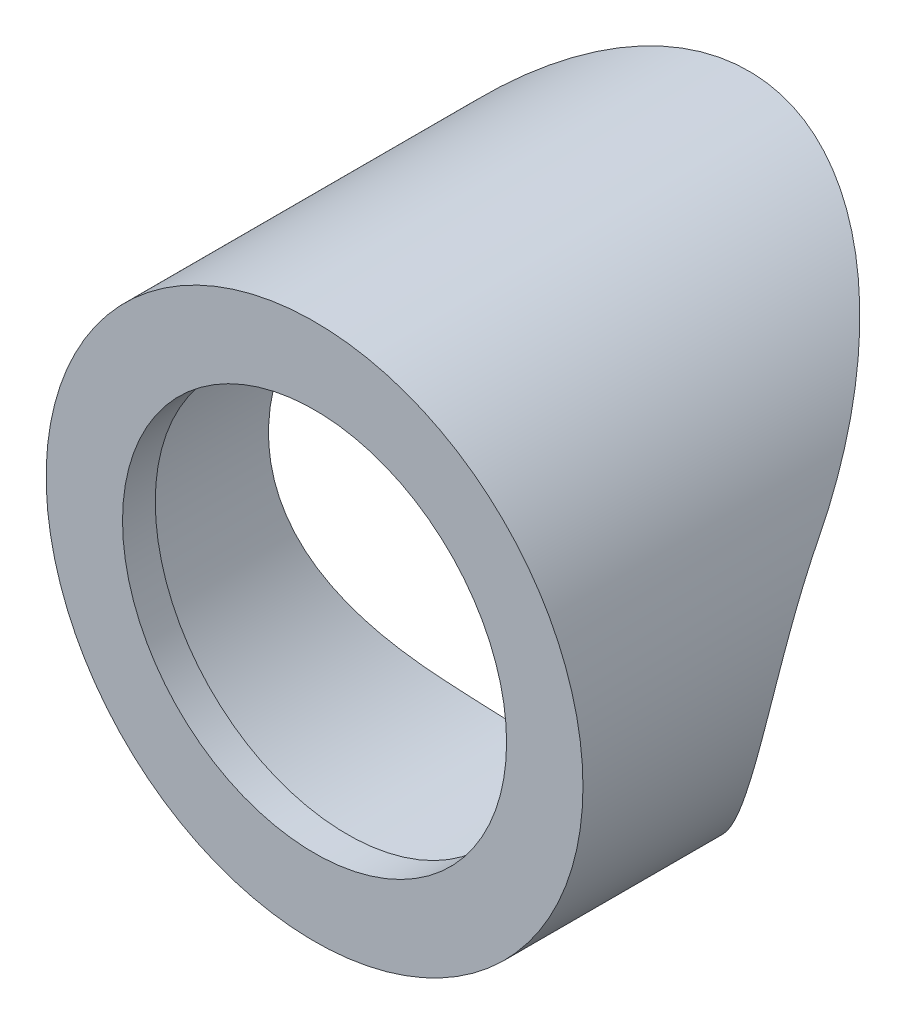
ISO-10303-21;
HEADER;
FILE_DESCRIPTION(('STEP AP214'),'2;1');
FILE_NAME('part.step','',(''),(''),'','','');
FILE_SCHEMA(('AUTOMOTIVE_DESIGN { 1 0 10303 214 1 1 1 1 }'));
ENDSEC;
DATA;
#1=APPLICATION_CONTEXT('core data for automotive mechanical design processes');
#2=APPLICATION_PROTOCOL_DEFINITION('international standard','automotive_design',2000,#1);
#3=PRODUCT_CONTEXT('',#1,'mechanical');
#4=PRODUCT('Part','Part','',(#3));
#5=PRODUCT_RELATED_PRODUCT_CATEGORY('part','',(#4));
#6=PRODUCT_DEFINITION_FORMATION('','',#4);
#7=PRODUCT_DEFINITION_CONTEXT('part definition',#1,'design');
#8=PRODUCT_DEFINITION('design','',#6,#7);
#9=PRODUCT_DEFINITION_SHAPE('','',#8);
#10=(LENGTH_UNIT() NAMED_UNIT(*) SI_UNIT(.MILLI.,.METRE.));
#11=(NAMED_UNIT(*) PLANE_ANGLE_UNIT() SI_UNIT($,.RADIAN.));
#12=(NAMED_UNIT(*) SI_UNIT($,.STERADIAN.) SOLID_ANGLE_UNIT());
#13=UNCERTAINTY_MEASURE_WITH_UNIT(LENGTH_MEASURE(1.E-05),#10,'distance_accuracy_value','');
#14=(GEOMETRIC_REPRESENTATION_CONTEXT(3) GLOBAL_UNCERTAINTY_ASSIGNED_CONTEXT((#13)) GLOBAL_UNIT_ASSIGNED_CONTEXT((#10,
#11,#12)) REPRESENTATION_CONTEXT('',''));
#15=CARTESIAN_POINT('',(0.,0.,0.));
#16=DIRECTION('',(0.,0.,1.));
#17=DIRECTION('',(1.,0.,0.));
#18=AXIS2_PLACEMENT_3D('',#15,#16,#17);
#19=CARTESIAN_POINT('',(0.,0.,0.));
#20=DIRECTION('',(0.,0.,1.));
#21=DIRECTION('',(1.,0.,0.));
#22=AXIS2_PLACEMENT_3D('',#19,#20,#21);
#23=CYLINDRICAL_SURFACE('',#22,10.8);
#24=CARTESIAN_POINT('',(10.1174201894594,3.77859877599078,-11.3604184643851));
#25=CARTESIAN_POINT('',(10.1794931564768,3.61242547592925,-11.1938837947332));
#26=CARTESIAN_POINT('',(10.2392537936822,3.43989023089011,-11.0327415753184));
#27=CARTESIAN_POINT('',(10.3524528996894,3.08250314850726,-10.7220157417117));
#28=CARTESIAN_POINT('',(10.4058860181338,2.89764109151905,-10.5724419459727));
#29=CARTESIAN_POINT('',(10.5049574524424,2.51499479401015,-10.2849372562771));
#30=CARTESIAN_POINT('',(10.5505404180285,2.31713138354535,-10.1470922495286));
#31=CARTESIAN_POINT('',(10.6316925962494,1.91051625282432,-9.88527239071304));
#32=CARTESIAN_POINT('',(10.6672642748281,1.70176722891484,-9.76129412758158));
#33=CARTESIAN_POINT('',(10.726878703958,1.27323657642441,-9.52757700378918));
#34=CARTESIAN_POINT('',(10.7508536791937,1.05339818966113,-9.41792452279212));
#35=CARTESIAN_POINT('',(10.7853640473005,0.605313972263464,-9.21476558539735));
#36=CARTESIAN_POINT('',(10.7958985422696,0.377067580973459,-9.12126020808069));
#37=CARTESIAN_POINT('',(10.8021282547242,-0.0851100916871967,-8.95162642835171));
#38=CARTESIAN_POINT('',(10.7978751092792,-0.319018764407659,-8.87543854604315));
#39=CARTESIAN_POINT('',(10.773581696638,-0.791049377165576,-8.74069457667046));
#40=CARTESIAN_POINT('',(10.7535436022563,-1.02917073291327,-8.68213606443869));
#41=CARTESIAN_POINT('',(10.6999389081166,-1.48254136705154,-8.58805361255833));
#42=CARTESIAN_POINT('',(10.6679784233919,-1.69762009931701,-8.55077830026144));
#43=CARTESIAN_POINT('',(10.5906549645977,-2.12736440740652,-8.49056964525188));
#44=CARTESIAN_POINT('',(10.5452929244348,-2.3420300109712,-8.46763530351511));
#45=CARTESIAN_POINT('',(10.4412277241132,-2.76932510382129,-8.435737797571));
#46=CARTESIAN_POINT('',(10.3825139070613,-2.98195282449246,-8.42678583873876));
#47=CARTESIAN_POINT('',(10.2521209867481,-3.40333047378461,-8.42226134160314));
#48=CARTESIAN_POINT('',(10.1804416772089,-3.61208034065154,-8.42668901618437));
#49=CARTESIAN_POINT('',(10.0277272725771,-4.01615543164467,-8.44765314971861));
#50=CARTESIAN_POINT('',(9.94716771253965,-4.21168639330762,-8.46370926975622));
#51=CARTESIAN_POINT('',(9.77517875587511,-4.59677827367746,-8.50649217455549));
#52=CARTESIAN_POINT('',(9.68374526837359,-4.7863369113996,-8.53322298421042));
#53=CARTESIAN_POINT('',(9.49072915250163,-5.15848740504022,-8.59635141119977));
#54=CARTESIAN_POINT('',(9.38914842924468,-5.34108055984503,-8.63274721607989));
#55=CARTESIAN_POINT('',(9.17650855062802,-5.69868306596206,-8.71416022184261));
#56=CARTESIAN_POINT('',(9.06544748990404,-5.87369088206122,-8.75917915807993));
#57=CARTESIAN_POINT('',(8.78678427150413,-6.28628755311686,-8.87694749999877));
#58=CARTESIAN_POINT('',(8.61478415152814,-6.51984833153495,-8.95346808394584));
#59=CARTESIAN_POINT('',(8.25492207362913,-6.96988895011912,-9.11860372410774));
#60=CARTESIAN_POINT('',(8.06705388364549,-7.18636201404141,-9.20722354070377));
#61=CARTESIAN_POINT('',(7.67658401181855,-7.60207489273052,-9.39376714484364));
#62=CARTESIAN_POINT('',(7.47395447829051,-7.80128049154225,-9.49170863306011));
#63=CARTESIAN_POINT('',(7.05547122136559,-8.18170386177411,-9.69380770548377));
#64=CARTESIAN_POINT('',(6.83962082214252,-8.36292612503288,-9.79796372697762));
#65=CARTESIAN_POINT('',(6.4732631770449,-8.64697677472154,-9.97249207575987));
#66=CARTESIAN_POINT('',(6.32633156008781,-8.75504099694643,-10.0419277315469));
#67=CARTESIAN_POINT('',(6.02738536452259,-8.96347130374947,-10.1813259590382));
#68=CARTESIAN_POINT('',(5.87537178401822,-9.06383888734983,-10.2512884252093));
#69=CARTESIAN_POINT('',(5.567185561646,-9.25631073502879,-10.3904933016586));
#70=CARTESIAN_POINT('',(5.41103971880845,-9.34845657961325,-10.4597375606831));
#71=CARTESIAN_POINT('',(5.09383972010291,-9.5250038332775,-10.5969515560205));
#72=CARTESIAN_POINT('',(4.93278457051986,-9.60940366039675,-10.6649210297402));
#73=CARTESIAN_POINT('',(4.76932112072184,-9.68986976421441,-10.7317717520143));
#74=B_SPLINE_CURVE_WITH_KNOTS('',3,(#24,#25,#26,#27,#28,#29,#30,#31,#32,#33,#34,#35,#36,#37,#38,
#39,#40,#41,#42,#43,#44,#45,#46,#47,#48,#49,#50,#51,#52,#53,#54,#55,#56,#57,#58,#59,#60,#61,#62,
#63,#64,#65,#66,#67,#68,#69,#70,#71,#72,#73),.UNSPECIFIED.,.F.,.F.,(4,2,2,2,2,2,2,2,2,2,2,2,2,2,
2,2,2,2,2,2,2,2,2,2,4),(0.,0.729877879515436,1.46036858018938,2.19581589035946,2.9310818889509,
3.67059462868141,4.41015676957054,5.14713902552239,5.8840198528327,6.5449979969981,
7.20593009081534,7.86739157931146,8.52886359243883,9.16446586942384,9.80030802695957,
10.4360310305806,11.0718821044066,11.9705190314419,12.8695105469716,13.7702445507676,
14.6707530018625,15.2560408787027,15.8412144719285,16.4232374746841,17.0053790800675),.UNSPECIFIED.);
#75=CARTESIAN_POINT('',(10.1174201894594,3.77859877599078,-11.3604184643851));
#76=VERTEX_POINT('',#75);
#77=CARTESIAN_POINT('',(4.76932112072183,-9.68986976421441,-10.7317717520143));
#78=VERTEX_POINT('',#77);
#79=EDGE_CURVE('E163',#76,#78,#74,.T.);
#80=ORIENTED_EDGE('',*,*,#79,.T.);
#81=CARTESIAN_POINT('',(0.,0.,-2.682422698844));
#82=DIRECTION('',(0.,-0.638986976421441,0.769217553078312));
#83=DIRECTION('',(0.,0.769217553078312,0.638986976421441));
#84=AXIS2_PLACEMENT_3D('',#81,#82,#83);
#85=ELLIPSE('',#84,14.0402412253591,10.8);
#86=CARTESIAN_POINT('',(-4.76932112072183,-9.68986976421441,-10.7317717520143));
#87=VERTEX_POINT('',#86);
#88=EDGE_CURVE('E178',#78,#87,#85,.F.);
#89=ORIENTED_EDGE('',*,*,#88,.T.);
#90=CARTESIAN_POINT('',(-4.76932112072184,-9.68986976421441,-10.7317717520143));
#91=CARTESIAN_POINT('',(-4.90844394222123,-9.62138829170573,-10.6748818296333));
#92=CARTESIAN_POINT('',(-5.04580589438974,-9.55006287259274,-10.6171804872056));
#93=CARTESIAN_POINT('',(-5.31699927533946,-9.40177790907193,-10.5007417544739));
#94=CARTESIAN_POINT('',(-5.4508308111771,-9.32481853577604,-10.4420043956765));
#95=CARTESIAN_POINT('',(-5.84718046922042,-9.08547224206524,-10.2650455784435));
#96=CARTESIAN_POINT('',(-6.10439420628831,-8.91469573629019,-10.1461439105739));
#97=CARTESIAN_POINT('',(-6.60609330924962,-8.54965406476154,-9.9099101580176));
#98=CARTESIAN_POINT('',(-6.85045421525862,-8.35520437949373,-9.79259952052588));
#99=CARTESIAN_POINT('',(-7.32310014276729,-7.94419306095535,-9.56467786361434));
#100=CARTESIAN_POINT('',(-7.5513914501713,-7.72764015587526,-9.45406422694085));
#101=CARTESIAN_POINT('',(-7.94679927527515,-7.3179584610538,-9.26445251232057));
#102=CARTESIAN_POINT('',(-8.11705304427286,-7.12873545364422,-9.18354166359209));
#103=CARTESIAN_POINT('',(-8.44536656846443,-6.73655417813437,-9.03063168030387));
#104=CARTESIAN_POINT('',(-8.60342667275648,-6.53359630356862,-8.95863229057806));
#105=CARTESIAN_POINT('',(-8.90565997578074,-6.11519358024494,-8.82589055095558));
#106=CARTESIAN_POINT('',(-9.04987851817883,-5.89979348508295,-8.76511079695021));
#107=CARTESIAN_POINT('',(-9.32371413086381,-5.45675058350458,-8.65663416211408));
#108=CARTESIAN_POINT('',(-9.45333385711144,-5.22911001516578,-8.60893489927824));
#109=CARTESIAN_POINT('',(-9.67612706681084,-4.80212499233172,-8.53545221544959));
#110=CARTESIAN_POINT('',(-9.77176318851316,-4.6044648494525,-8.50733159798183));
#111=CARTESIAN_POINT('',(-9.95121401391764,-4.20258745425065,-8.46271297982541));
#112=CARTESIAN_POINT('',(-10.0350308883984,-3.99837141449562,-8.44621284263519));
#113=CARTESIAN_POINT('',(-10.1901727524022,-3.58457904613153,-8.42585111715797));
#114=CARTESIAN_POINT('',(-10.2614957893929,-3.37500188554317,-8.42199150266228));
#115=CARTESIAN_POINT('',(-10.3910802996728,-2.95201169791183,-8.42776618929534));
#116=CARTESIAN_POINT('',(-10.4493416259926,-2.73859862773666,-8.43740064224952));
#117=CARTESIAN_POINT('',(-10.5526241555906,-2.30891896361355,-8.47083999309195));
#118=CARTESIAN_POINT('',(-10.5976004003125,-2.0926452105824,-8.49469220242022));
#119=CARTESIAN_POINT('',(-10.6739587352514,-1.65979025752769,-8.55695584427886));
#120=CARTESIAN_POINT('',(-10.7053407660289,-1.44320905616398,-8.59536734046702));
#121=CARTESIAN_POINT('',(-10.7547050440594,-1.01167053962161,-8.68679246160166));
#122=CARTESIAN_POINT('',(-10.7726906662861,-0.796712828952375,-8.7398024041308));
#123=CARTESIAN_POINT('',(-10.7957672144253,-0.370173904368583,-8.86020188145004));
#124=CARTESIAN_POINT('',(-10.8008585139772,-0.158592592792481,-8.92759099951265));
#125=CARTESIAN_POINT('',(-10.7989569248242,0.248550230732577,-9.07236995162907));
#126=CARTESIAN_POINT('',(-10.7925851195051,0.444369236783353,-9.14904797691246));
#127=CARTESIAN_POINT('',(-10.7697681977947,0.830354038931394,-9.31437669312264));
#128=CARTESIAN_POINT('',(-10.7533193050774,1.02051768769317,-9.40303186269718));
#129=CARTESIAN_POINT('',(-10.7112808618499,1.39421618741673,-9.59172367426366));
#130=CARTESIAN_POINT('',(-10.6856852355193,1.57774654269361,-9.69176785135828));
#131=CARTESIAN_POINT('',(-10.6263987177402,1.9372324877053,-9.90251262233737));
#132=CARTESIAN_POINT('',(-10.5927058937781,2.11318625733913,-10.0132157563505));
#133=CARTESIAN_POINT('',(-10.4968145686986,2.5561143047006,-10.3114498428884));
#134=CARTESIAN_POINT('',(-10.4293871746607,2.81701041388066,-10.506446485286));
#135=CARTESIAN_POINT('',(-10.3186564578059,3.19095523323455,-10.8151653036107));
#136=CARTESIAN_POINT('',(-10.2802243313478,3.31250394447468,-10.9205749002604));
#137=CARTESIAN_POINT('',(-10.2006922040711,3.54986138314221,-11.1366225951371));
#138=CARTESIAN_POINT('',(-10.1595932507717,3.66567233319238,-11.2472586358482));
#139=CARTESIAN_POINT('',(-10.1174201894594,3.77859877599078,-11.3604184643851));
#140=B_SPLINE_CURVE_WITH_KNOTS('',3,(#90,#91,#92,#93,#94,#95,#96,#97,#98,#99,#100,#101,#102,
#103,#104,#105,#106,#107,#108,#109,#110,#111,#112,#113,#114,#115,#116,#117,#118,#119,#120,#121,
#122,#123,#124,#125,#126,#127,#128,#129,#130,#131,#132,#133,#134,#135,#136,#137,#138,#139),
.UNSPECIFIED.,.F.,.F.,(4,2,2,2,2,2,2,2,2,2,2,2,2,2,2,2,2,2,2,2,2,2,2,2,4),(0.,0.495430585583188,
0.990846130407451,1.98224494084897,2.9819361611474,3.98123413630672,4.78180769374285,
5.58235832266819,6.38018986850857,7.17787602969271,7.84133383759287,8.50466963255387,
9.16810900108161,9.8315558342068,10.497222795407,11.1628926671463,11.8283947790784,
12.4938776064997,13.124382458355,13.7551237326483,14.3862847651074,15.0175965831581,
16.0132704713566,16.5093559270022,17.0052476881598),.UNSPECIFIED.);
#141=CARTESIAN_POINT('',(-10.1174201894594,3.77859877599078,-11.3604184643851));
#142=VERTEX_POINT('',#141);
#143=EDGE_CURVE('E171',#87,#142,#140,.T.);
#144=ORIENTED_EDGE('',*,*,#143,.T.);
#145=CARTESIAN_POINT('',(0.,0.,-7.57375809131953));
#146=DIRECTION('',(0.,0.707859877599078,0.706352881841235));
#147=DIRECTION('',(0.,-0.706352881841235,0.707859877599078));
#148=AXIS2_PLACEMENT_3D('',#145,#146,#147);
#149=ELLIPSE('',#148,15.2898080798479,10.8);
#150=EDGE_CURVE('E212',#142,#76,#149,.F.);
#151=ORIENTED_EDGE('',*,*,#150,.T.);
#152=EDGE_LOOP('',(#80,#89,#144,#151));
#153=FACE_BOUND('',#152,.T.);
#154=DIRECTION('',(0.,0.,1.));
#155=VECTOR('',#154,1.);
#156=CARTESIAN_POINT('',(1.,10.7536040470161,0.));
#157=LINE('',#156,#155);
#158=CARTESIAN_POINT('',(1.,10.7536040470161,-6.5));
#159=VERTEX_POINT('',#158);
#160=CARTESIAN_POINT('',(1.,10.7536040470161,-1.5));
#161=VERTEX_POINT('',#160);
#162=EDGE_CURVE('E117',#159,#161,#157,.T.);
#163=ORIENTED_EDGE('',*,*,#162,.F.);
#164=CARTESIAN_POINT('',(0.,0.,-6.5));
#165=DIRECTION('',(0.,0.,-1.));
#166=DIRECTION('',(-1.,0.,0.));
#167=AXIS2_PLACEMENT_3D('',#164,#165,#166);
#168=CIRCLE('',#167,10.8);
#169=CARTESIAN_POINT('',(-0.999999999999999,10.7536040470161,-6.5));
#170=VERTEX_POINT('',#169);
#171=EDGE_CURVE('E11',#159,#170,#168,.F.);
#172=ORIENTED_EDGE('',*,*,#171,.T.);
#173=DIRECTION('',(0.,0.,1.));
#174=VECTOR('',#173,1.);
#175=CARTESIAN_POINT('',(-0.999999999999999,10.7536040470161,0.));
#176=LINE('',#175,#174);
#177=CARTESIAN_POINT('',(-0.999999999999999,10.7536040470161,-1.5));
#178=VERTEX_POINT('',#177);
#179=EDGE_CURVE('E115',#178,#170,#176,.F.);
#180=ORIENTED_EDGE('',*,*,#179,.F.);
#181=CARTESIAN_POINT('',(0.,0.,-1.5));
#182=DIRECTION('',(0.,0.,1.));
#183=DIRECTION('',(1.,0.,0.));
#184=AXIS2_PLACEMENT_3D('',#181,#182,#183);
#185=CIRCLE('',#184,10.8);
#186=EDGE_CURVE('E205',#178,#161,#185,.T.);
#187=ORIENTED_EDGE('',*,*,#186,.T.);
#188=EDGE_LOOP('',(#163,#172,#180,#187));
#189=FACE_BOUND('',#188,.T.);
#190=ADVANCED_FACE('F33',(#153,#189),#23,.F.);
#191=CARTESIAN_POINT('',(0.,8.8,-1.5));
#192=DIRECTION('',(0.,0.,1.));
#193=DIRECTION('',(1.,0.,0.));
#194=AXIS2_PLACEMENT_3D('',#191,#192,#193);
#195=PLANE('',#194);
#196=CARTESIAN_POINT('',(0.,0.,-1.5));
#197=DIRECTION('',(0.,0.,1.));
#198=DIRECTION('',(1.,0.,0.));
#199=AXIS2_PLACEMENT_3D('',#196,#197,#198);
#200=CIRCLE('',#199,8.8);
#201=CARTESIAN_POINT('',(8.8,0.,-1.5));
#202=VERTEX_POINT('',#201);
#203=EDGE_CURVE('E199',#202,#202,#200,.T.);
#204=ORIENTED_EDGE('',*,*,#203,.T.);
#205=EDGE_LOOP('',(#204));
#206=FACE_BOUND('',#205,.T.);
#207=DIRECTION('',(0.,-1.,0.));
#208=VECTOR('',#207,1.);
#209=CARTESIAN_POINT('',(1.,8.8,-1.5));
#210=LINE('',#209,#208);
#211=CARTESIAN_POINT('',(1.,9.3,-1.5));
#212=VERTEX_POINT('',#211);
#213=EDGE_CURVE('E41',#161,#212,#210,.T.);
#214=ORIENTED_EDGE('',*,*,#213,.F.);
#215=ORIENTED_EDGE('',*,*,#186,.F.);
#216=DIRECTION('',(0.,1.,0.));
#217=VECTOR('',#216,1.);
#218=CARTESIAN_POINT('',(-0.999999999999999,9.3,-1.5));
#219=LINE('',#218,#217);
#220=CARTESIAN_POINT('',(-0.999999999999999,9.3,-1.5));
#221=VERTEX_POINT('',#220);
#222=EDGE_CURVE('E101',#221,#178,#219,.T.);
#223=ORIENTED_EDGE('',*,*,#222,.F.);
#224=DIRECTION('',(-1.,0.,0.));
#225=VECTOR('',#224,1.);
#226=CARTESIAN_POINT('',(-0.999999999999999,9.3,-1.5));
#227=LINE('',#226,#225);
#228=EDGE_CURVE('E321',#212,#221,#227,.T.);
#229=ORIENTED_EDGE('',*,*,#228,.F.);
#230=EDGE_LOOP('',(#214,#215,#223,#229));
#231=FACE_BOUND('',#230,.T.);
#232=ADVANCED_FACE('F182',(#206,#231),#195,.F.);
#233=CARTESIAN_POINT('',(0.,0.,0.));
#234=DIRECTION('',(0.,0.,1.));
#235=DIRECTION('',(1.,0.,0.));
#236=AXIS2_PLACEMENT_3D('',#233,#234,#235);
#237=CYLINDRICAL_SURFACE('',#236,12.3);
#238=CARTESIAN_POINT('',(0.,0.,0.));
#239=DIRECTION('',(0.,0.,1.));
#240=DIRECTION('',(1.,0.,0.));
#241=AXIS2_PLACEMENT_3D('',#238,#239,#240);
#242=CIRCLE('',#241,12.3);
#243=CARTESIAN_POINT('',(12.3,0.,0.));
#244=VERTEX_POINT('',#243);
#245=EDGE_CURVE('E210',#244,#244,#242,.T.);
#246=ORIENTED_EDGE('',*,*,#245,.F.);
#247=EDGE_LOOP('',(#246));
#248=FACE_BOUND('',#247,.T.);
#249=CARTESIAN_POINT('',(0.,0.,-2.682422698844));
#250=DIRECTION('',(0.,-0.638986976421441,0.769217553078312));
#251=DIRECTION('',(0.,0.769217553078312,0.638986976421441));
#252=AXIS2_PLACEMENT_3D('',#249,#250,#251);
#253=ELLIPSE('',#252,15.9902747288813,12.3);
#254=CARTESIAN_POINT('',(-7.57604276338006,-9.68986976421441,-10.7317717520143));
#255=VERTEX_POINT('',#254);
#256=CARTESIAN_POINT('',(7.57604276338006,-9.68986976421441,-10.7317717520143));
#257=VERTEX_POINT('',#256);
#258=EDGE_CURVE('E203',#255,#257,#253,.T.);
#259=ORIENTED_EDGE('',*,*,#258,.T.);
#260=CARTESIAN_POINT('',(7.57604276338007,-9.68986976421441,-10.7317717520143));
#261=CARTESIAN_POINT('',(7.81302846106629,-9.50454693810127,-10.5778216006998));
#262=CARTESIAN_POINT('',(8.0446732236437,-9.30945574002523,-10.4270855450943));
#263=CARTESIAN_POINT('',(8.49638819979703,-8.89914903923316,-10.1346094853551));
#264=CARTESIAN_POINT('',(8.71643677409934,-8.68389785948235,-9.99288620443723));
#265=CARTESIAN_POINT('',(9.14517678505168,-8.23126598782964,-9.72032421526626));
#266=CARTESIAN_POINT('',(9.35374427038346,-7.99369893317176,-9.58959837669163));
#267=CARTESIAN_POINT('',(9.75529024048928,-7.49838937578549,-9.34375556976764));
#268=CARTESIAN_POINT('',(9.94828023653688,-7.24066205339688,-9.22862703202011));
#269=CARTESIAN_POINT('',(10.2715819205967,-6.7708850710056,-9.0431028495289));
#270=CARTESIAN_POINT('',(10.4056934698166,-6.56304375726584,-8.96864805103618));
#271=CARTESIAN_POINT('',(10.6627049115787,-6.13666449360393,-8.83210606602734));
#272=CARTESIAN_POINT('',(10.7856075663694,-5.91812919954667,-8.77001582797973));
#273=CARTESIAN_POINT('',(11.018720840682,-5.47183407538543,-8.65994238038225));
#274=CARTESIAN_POINT('',(11.1289694288684,-5.24410476814308,-8.61191626063408));
#275=CARTESIAN_POINT('',(11.3360732434227,-4.77995916483847,-8.53126348379237));
#276=CARTESIAN_POINT('',(11.432928624698,-4.54354296928975,-8.49863664857845));
#277=CARTESIAN_POINT('',(11.613043496349,-4.0612914090418,-8.44999551478271));
#278=CARTESIAN_POINT('',(11.6961646567839,-3.81538776245418,-8.43414245737267));
#279=CARTESIAN_POINT('',(11.8467790435979,-3.31832108500905,-8.42087450476955));
#280=CARTESIAN_POINT('',(11.9142720846046,-3.06715799180532,-8.42345982827114));
#281=CARTESIAN_POINT('',(12.0330291566664,-2.56194169285166,-8.44801482339476));
#282=CARTESIAN_POINT('',(12.0842930688773,-2.3078884659517,-8.46998463696288));
#283=CARTESIAN_POINT('',(12.1703816200907,-1.79951408769634,-8.53384386401596));
#284=CARTESIAN_POINT('',(12.2052082868901,-1.54519297327085,-8.57573081912257));
#285=CARTESIAN_POINT('',(12.2552331482641,-1.07165091277441,-8.67278698133924));
#286=CARTESIAN_POINT('',(12.2723843351532,-0.852135550744963,-8.72554467321004));
#287=CARTESIAN_POINT('',(12.2948753470356,-0.41662435935956,-8.84599445096591));
#288=CARTESIAN_POINT('',(12.3002151621707,-0.200628532941283,-8.91368654931575));
#289=CARTESIAN_POINT('',(12.299771436063,0.226307249854208,-9.06358583391928));
#290=CARTESIAN_POINT('',(12.2939847166108,0.437245744217679,-9.14579716138779));
#291=CARTESIAN_POINT('',(12.2721765838227,0.852606558124577,-9.32411517961643));
#292=CARTESIAN_POINT('',(12.2561550181363,1.05702878062269,-9.42022207720216));
#293=CARTESIAN_POINT('',(12.2147612905535,1.45976634693809,-9.62643517333188));
#294=CARTESIAN_POINT('',(12.1893153957581,1.65801980063708,-9.7366471517356));
#295=CARTESIAN_POINT('',(12.1302632456155,2.04577483694788,-9.96972425868864));
#296=CARTESIAN_POINT('',(12.0966534781582,2.23527261098087,-10.0925948198428));
#297=CARTESIAN_POINT('',(12.0225903560837,2.6043634257923,-10.3499735552996));
#298=CARTESIAN_POINT('',(11.9821464659401,2.78396971513052,-10.4844655111247));
#299=CARTESIAN_POINT('',(11.8956734958593,3.13293098321437,-10.7644804709943));
#300=CARTESIAN_POINT('',(11.8496450021178,3.30228703509832,-10.91000231667));
#301=CARTESIAN_POINT('',(11.7858576104546,3.51946615959227,-11.1095702423113));
#302=CARTESIAN_POINT('',(11.7699982952565,3.57213006444725,-11.1590286121746));
#303=CARTESIAN_POINT('',(11.7378926697164,3.67625336822622,-11.2589568645474));
#304=CARTESIAN_POINT('',(11.7216468001749,3.72771401783654,-11.3094255853924));
#305=CARTESIAN_POINT('',(11.7052206852362,3.77859877599078,-11.3604184643851));
#306=B_SPLINE_CURVE_WITH_KNOTS('',3,(#260,#261,#262,#263,#264,#265,#266,#267,#268,#269,#270,
#271,#272,#273,#274,#275,#276,#277,#278,#279,#280,#281,#282,#283,#284,#285,#286,#287,#288,#289,
#290,#291,#292,#293,#294,#295,#296,#297,#298,#299,#300,#301,#302,#303,#304,#305),.UNSPECIFIED.,
.F.,.F.,(4,2,2,2,2,2,2,2,2,2,2,2,2,2,2,2,2,2,2,2,2,2,4),(0.,1.01386251504113,2.02955443989747,
3.05464611583558,4.07897321091346,4.85324122902337,5.62731792295256,6.39900766520262,
7.17068848125698,7.94972164680578,8.72876405235676,9.50781216261995,10.2867641397077,
10.9651969114485,11.6436302494339,12.3222574054919,13.0008946634685,13.6849575502964,
14.3693152448161,15.0527328357275,15.7360787527129,15.9579679732112,16.1796152642386),.UNSPECIFIED.);
#307=CARTESIAN_POINT('',(11.7052206852362,3.77859877599078,-11.3604184643851));
#308=VERTEX_POINT('',#307);
#309=EDGE_CURVE('E140',#257,#308,#306,.T.);
#310=ORIENTED_EDGE('',*,*,#309,.T.);
#311=CARTESIAN_POINT('',(0.,0.,-7.57375809131953));
#312=DIRECTION('',(0.,0.707859877599078,0.706352881841235));
#313=DIRECTION('',(0.,-0.706352881841235,0.707859877599078));
#314=AXIS2_PLACEMENT_3D('',#311,#312,#313);
#315=ELLIPSE('',#314,17.4133925353824,12.3);
#316=CARTESIAN_POINT('',(-11.7052206852362,3.77859877599078,-11.3604184643851));
#317=VERTEX_POINT('',#316);
#318=EDGE_CURVE('E131',#308,#317,#315,.T.);
#319=ORIENTED_EDGE('',*,*,#318,.T.);
#320=CARTESIAN_POINT('',(-11.7052206852362,3.77859877599078,-11.3604184643851));
#321=CARTESIAN_POINT('',(-11.7609754486161,3.60592382525515,-11.1873638730048));
#322=CARTESIAN_POINT('',(-11.8146582225443,3.42651692900035,-11.0202774874229));
#323=CARTESIAN_POINT('',(-11.9161706231336,3.054822610223,-10.6988842879099));
#324=CARTESIAN_POINT('',(-11.963996005717,2.86252600250664,-10.5445867662405));
#325=CARTESIAN_POINT('',(-12.0522399371363,2.46480095362619,-10.2490599665861));
#326=CARTESIAN_POINT('',(-12.092616511977,2.25930639659111,-10.1079068400407));
#327=CARTESIAN_POINT('',(-12.1639035894428,1.83718387904742,-9.84072455255495));
#328=CARTESIAN_POINT('',(-12.1948161541659,1.62055835587764,-9.71469210063927));
#329=CARTESIAN_POINT('',(-12.2456768815328,1.17627938459499,-9.47819065564061));
#330=CARTESIAN_POINT('',(-12.265568718465,0.94857563898662,-9.36780372172099));
#331=CARTESIAN_POINT('',(-12.2926379443508,0.484772017938569,-9.16437831550382));
#332=CARTESIAN_POINT('',(-12.2998145770091,0.248671643922591,-9.07134087544198));
#333=CARTESIAN_POINT('',(-12.3001777538698,-0.229232654177064,-8.90374181533148));
#334=CARTESIAN_POINT('',(-12.293406159422,-0.471017365333707,-8.82912566210549));
#335=CARTESIAN_POINT('',(-12.2650107554854,-0.958723394413183,-8.69861312272909));
#336=CARTESIAN_POINT('',(-12.2433886532046,-1.20464423367874,-8.64271458590803));
#337=CARTESIAN_POINT('',(-12.1874269838837,-1.67559202776083,-8.55412702311417));
#338=CARTESIAN_POINT('',(-12.1544334970822,-1.90046982695458,-8.51978122900199));
#339=CARTESIAN_POINT('',(-12.0756141555553,-2.34979966476252,-8.4666238018299));
#340=CARTESIAN_POINT('',(-12.0297890988633,-2.5742517289807,-8.44781120300186));
#341=CARTESIAN_POINT('',(-11.9254216116983,-3.02109275062476,-8.42533261775549));
#342=CARTESIAN_POINT('',(-11.8668706708423,-3.24348022308605,-8.42167680037611));
#343=CARTESIAN_POINT('',(-11.7374624557126,-3.68439518361701,-8.42890550285976));
#344=CARTESIAN_POINT('',(-11.6666049095684,-3.90292258629472,-8.4397903439822));
#345=CARTESIAN_POINT('',(-11.5149348265709,-4.32971020135914,-8.47485224251921));
#346=CARTESIAN_POINT('',(-11.4343880013043,-4.53809094545853,-8.49871859017205));
#347=CARTESIAN_POINT('',(-11.2627483122437,-4.94874220245373,-8.55861776229396));
#348=CARTESIAN_POINT('',(-11.1716514643007,-5.15101037037513,-8.59465519300461));
#349=CARTESIAN_POINT('',(-10.9796577707161,-5.54849892571752,-8.67789713957636));
#350=CARTESIAN_POINT('',(-10.8787592601479,-5.74371810803406,-8.72510355458139));
#351=CARTESIAN_POINT('',(-10.6679253014286,-6.12642866502747,-8.82964318599193));
#352=CARTESIAN_POINT('',(-10.5579879560027,-6.3139184048106,-8.88697853140215));
#353=CARTESIAN_POINT('',(-10.2781840559637,-6.76367547878841,-9.03874827623723));
#354=CARTESIAN_POINT('',(-10.1037080419677,-7.02139441804544,-9.13823091909996));
#355=CARTESIAN_POINT('',(-9.73935780346041,-7.51864471307196,-9.35330838048876));
#356=CARTESIAN_POINT('',(-9.54947621909005,-7.75816726862938,-9.46891091931589));
#357=CARTESIAN_POINT('',(-9.15614131872613,-8.21868700783704,-9.71335023295459));
#358=CARTESIAN_POINT('',(-8.95268301177132,-8.43967731069298,-9.84219188411928));
#359=CARTESIAN_POINT('',(-8.53383908060448,-8.86296829990787,-10.1103371347296));
#360=CARTESIAN_POINT('',(-8.31845909060542,-9.06527769629797,-10.249635803069));
#361=CARTESIAN_POINT('',(-8.01224217362708,-9.33310575295563,-10.4483407495142));
#362=CARTESIAN_POINT('',(-7.92598029436323,-9.40646604219626,-10.5043855266264));
#363=CARTESIAN_POINT('',(-7.75208040403402,-9.55028507279709,-10.6173937544981));
#364=CARTESIAN_POINT('',(-7.66444606603424,-9.62075017415348,-10.6743547615672));
#365=CARTESIAN_POINT('',(-7.57604276338013,-9.6898697642145,-10.7317717520143));
#366=B_SPLINE_CURVE_WITH_KNOTS('',3,(#320,#321,#322,#323,#324,#325,#326,#327,#328,#329,#330,
#331,#332,#333,#334,#335,#336,#337,#338,#339,#340,#341,#342,#343,#344,#345,#346,#347,#348,#349,
#350,#351,#352,#353,#354,#355,#356,#357,#358,#359,#360,#361,#362,#363,#364,#365),.UNSPECIFIED.,
.F.,.F.,(4,2,2,2,2,2,2,2,2,2,2,2,2,2,2,2,2,2,2,2,2,2,4),(0.,0.752151673278088,1.50484514719689,
2.26165847748443,3.01830678935873,3.7787873892175,4.53931322065257,5.2975598916591,
6.05571940953446,6.74444338370693,7.43312453360867,8.12226766109268,8.81142601466644,
9.48477216530068,10.1583734351444,10.8320893247485,11.5059469918689,12.4846937261673,
13.4639108319432,14.4434899138008,15.4226099329288,15.8016218796454,16.1797510756939),.UNSPECIFIED.);
#367=EDGE_CURVE('E133',#317,#255,#366,.T.);
#368=ORIENTED_EDGE('',*,*,#367,.T.);
#369=EDGE_LOOP('',(#259,#310,#319,#368));
#370=FACE_BOUND('',#369,.T.);
#371=ADVANCED_FACE('F146',(#248,#370),#237,.T.);
#372=CARTESIAN_POINT('',(0.,8.8,0.));
#373=DIRECTION('',(0.,0.,-1.));
#374=DIRECTION('',(-1.,0.,0.));
#375=AXIS2_PLACEMENT_3D('',#372,#373,#374);
#376=PLANE('',#375);
#377=CARTESIAN_POINT('',(0.,0.,0.));
#378=DIRECTION('',(0.,0.,1.));
#379=DIRECTION('',(1.,0.,0.));
#380=AXIS2_PLACEMENT_3D('',#377,#378,#379);
#381=CIRCLE('',#380,8.8);
#382=CARTESIAN_POINT('',(8.8,0.,0.));
#383=VERTEX_POINT('',#382);
#384=EDGE_CURVE('E202',#383,#383,#381,.T.);
#385=ORIENTED_EDGE('',*,*,#384,.F.);
#386=EDGE_LOOP('',(#385));
#387=FACE_BOUND('',#386,.T.);
#388=ORIENTED_EDGE('',*,*,#245,.T.);
#389=EDGE_LOOP('',(#388));
#390=FACE_BOUND('',#389,.T.);
#391=ADVANCED_FACE('F35',(#387,#390),#376,.F.);
#392=CARTESIAN_POINT('',(0.,0.,0.));
#393=DIRECTION('',(0.,0.,1.));
#394=DIRECTION('',(1.,0.,0.));
#395=AXIS2_PLACEMENT_3D('',#392,#393,#394);
#396=CYLINDRICAL_SURFACE('',#395,8.8);
#397=ORIENTED_EDGE('',*,*,#203,.F.);
#398=EDGE_LOOP('',(#397));
#399=FACE_BOUND('',#398,.T.);
#400=ORIENTED_EDGE('',*,*,#384,.T.);
#401=EDGE_LOOP('',(#400));
#402=FACE_BOUND('',#401,.T.);
#403=ADVANCED_FACE('F187',(#399,#402),#396,.F.);
#404=CARTESIAN_POINT('',(-12.3,-9.68986976421441,-10.7317717520143));
#405=DIRECTION('',(0.,-0.638986976421441,0.769217553078312));
#406=DIRECTION('',(0.,-0.769217553078312,-0.638986976421441));
#407=AXIS2_PLACEMENT_3D('',#404,#405,#406);
#408=PLANE('',#407);
#409=DIRECTION('',(1.,0.,0.));
#410=VECTOR('',#409,1.);
#411=CARTESIAN_POINT('',(-12.3,-9.68986976421441,-10.7317717520143));
#412=LINE('',#411,#410);
#413=EDGE_CURVE('E127',#255,#87,#412,.T.);
#414=ORIENTED_EDGE('',*,*,#413,.T.);
#415=ORIENTED_EDGE('',*,*,#88,.F.);
#416=EDGE_CURVE('E124',#78,#257,#412,.T.);
#417=ORIENTED_EDGE('',*,*,#416,.T.);
#418=ORIENTED_EDGE('',*,*,#258,.F.);
#419=EDGE_LOOP('',(#414,#415,#417,#418));
#420=FACE_BOUND('',#419,.T.);
#421=ADVANCED_FACE('F155',(#420),#408,.F.);
#422=CARTESIAN_POINT('',(-12.3,-3.3,-18.4239472827974));
#423=DIRECTION('',(1.,0.,0.));
#424=DIRECTION('',(0.,0.,-1.));
#425=AXIS2_PLACEMENT_3D('',#422,#423,#424);
#426=CYLINDRICAL_SURFACE('',#425,10.);
#427=ORIENTED_EDGE('',*,*,#416,.F.);
#428=ORIENTED_EDGE('',*,*,#79,.F.);
#429=DIRECTION('',(1.,0.,0.));
#430=VECTOR('',#429,1.);
#431=CARTESIAN_POINT('',(-12.3,3.77859877599078,-11.3604184643851));
#432=LINE('',#431,#430);
#433=EDGE_CURVE('E123',#76,#308,#432,.T.);
#434=ORIENTED_EDGE('',*,*,#433,.T.);
#435=ORIENTED_EDGE('',*,*,#309,.F.);
#436=EDGE_LOOP('',(#427,#428,#434,#435));
#437=FACE_BOUND('',#436,.T.);
#438=ADVANCED_FACE('F149',(#437),#426,.F.);
#439=EDGE_CURVE('E128',#317,#142,#432,.T.);
#440=ORIENTED_EDGE('',*,*,#439,.T.);
#441=ORIENTED_EDGE('',*,*,#143,.F.);
#442=ORIENTED_EDGE('',*,*,#413,.F.);
#443=ORIENTED_EDGE('',*,*,#367,.F.);
#444=EDGE_LOOP('',(#440,#441,#442,#443));
#445=FACE_BOUND('',#444,.T.);
#446=ADVANCED_FACE('F154',(#445),#426,.F.);
#447=CARTESIAN_POINT('',(-12.3,3.77859877599078,-11.3604184643851));
#448=DIRECTION('',(0.,0.707859877599078,0.706352881841235));
#449=DIRECTION('',(0.,-0.706352881841235,0.707859877599078));
#450=AXIS2_PLACEMENT_3D('',#447,#448,#449);
#451=PLANE('',#450);
#452=ORIENTED_EDGE('',*,*,#433,.F.);
#453=ORIENTED_EDGE('',*,*,#150,.F.);
#454=ORIENTED_EDGE('',*,*,#439,.F.);
#455=ORIENTED_EDGE('',*,*,#318,.F.);
#456=EDGE_LOOP('',(#452,#453,#454,#455));
#457=FACE_BOUND('',#456,.T.);
#458=ADVANCED_FACE('F158',(#457),#451,.F.);
#459=CARTESIAN_POINT('',(0.,0.,-6.5));
#460=DIRECTION('',(0.,0.,-1.));
#461=DIRECTION('',(-1.,0.,0.));
#462=AXIS2_PLACEMENT_3D('',#459,#460,#461);
#463=PLANE('',#462);
#464=ORIENTED_EDGE('',*,*,#171,.F.);
#465=DIRECTION('',(0.,-1.,0.));
#466=VECTOR('',#465,1.);
#467=CARTESIAN_POINT('',(1.,9.3,-6.5));
#468=LINE('',#467,#466);
#469=CARTESIAN_POINT('',(1.,9.3,-6.5));
#470=VERTEX_POINT('',#469);
#471=EDGE_CURVE('E93',#159,#470,#468,.T.);
#472=ORIENTED_EDGE('',*,*,#471,.T.);
#473=DIRECTION('',(-1.,0.,0.));
#474=VECTOR('',#473,1.);
#475=CARTESIAN_POINT('',(-0.999999999999999,9.3,-6.5));
#476=LINE('',#475,#474);
#477=CARTESIAN_POINT('',(-0.999999999999999,9.3,-6.5));
#478=VERTEX_POINT('',#477);
#479=EDGE_CURVE('E96',#470,#478,#476,.T.);
#480=ORIENTED_EDGE('',*,*,#479,.T.);
#481=DIRECTION('',(0.,1.,0.));
#482=VECTOR('',#481,1.);
#483=CARTESIAN_POINT('',(-0.999999999999999,9.3,-6.5));
#484=LINE('',#483,#482);
#485=EDGE_CURVE('E111',#478,#170,#484,.T.);
#486=ORIENTED_EDGE('',*,*,#485,.T.);
#487=EDGE_LOOP('',(#464,#472,#480,#486));
#488=FACE_BOUND('',#487,.T.);
#489=ADVANCED_FACE('F95',(#488),#463,.T.);
#490=CARTESIAN_POINT('',(1.,9.3,-6.5));
#491=DIRECTION('',(-1.,0.,0.));
#492=DIRECTION('',(0.,0.,1.));
#493=AXIS2_PLACEMENT_3D('',#490,#491,#492);
#494=PLANE('',#493);
#495=ORIENTED_EDGE('',*,*,#471,.F.);
#496=ORIENTED_EDGE('',*,*,#162,.T.);
#497=ORIENTED_EDGE('',*,*,#213,.T.);
#498=DIRECTION('',(0.,0.,1.));
#499=VECTOR('',#498,1.);
#500=CARTESIAN_POINT('',(1.,9.3,-6.5));
#501=LINE('',#500,#499);
#502=EDGE_CURVE('E107',#470,#212,#501,.T.);
#503=ORIENTED_EDGE('',*,*,#502,.F.);
#504=EDGE_LOOP('',(#495,#496,#497,#503));
#505=FACE_BOUND('',#504,.T.);
#506=ADVANCED_FACE('F114',(#505),#494,.F.);
#507=CARTESIAN_POINT('',(-0.999999999999999,9.3,-6.5));
#508=DIRECTION('',(1.,0.,0.));
#509=DIRECTION('',(0.,0.,-1.));
#510=AXIS2_PLACEMENT_3D('',#507,#508,#509);
#511=PLANE('',#510);
#512=ORIENTED_EDGE('',*,*,#222,.T.);
#513=ORIENTED_EDGE('',*,*,#179,.T.);
#514=ORIENTED_EDGE('',*,*,#485,.F.);
#515=DIRECTION('',(0.,0.,1.));
#516=VECTOR('',#515,1.);
#517=CARTESIAN_POINT('',(-0.999999999999999,9.3,-6.5));
#518=LINE('',#517,#516);
#519=EDGE_CURVE('E109',#478,#221,#518,.T.);
#520=ORIENTED_EDGE('',*,*,#519,.T.);
#521=EDGE_LOOP('',(#512,#513,#514,#520));
#522=FACE_BOUND('',#521,.T.);
#523=ADVANCED_FACE('F295',(#522),#511,.F.);
#524=CARTESIAN_POINT('',(-0.999999999999999,9.3,-6.5));
#525=DIRECTION('',(0.,1.,0.));
#526=DIRECTION('',(0.,0.,1.));
#527=AXIS2_PLACEMENT_3D('',#524,#525,#526);
#528=PLANE('',#527);
#529=ORIENTED_EDGE('',*,*,#228,.T.);
#530=ORIENTED_EDGE('',*,*,#519,.F.);
#531=ORIENTED_EDGE('',*,*,#479,.F.);
#532=ORIENTED_EDGE('',*,*,#502,.T.);
#533=EDGE_LOOP('',(#529,#530,#531,#532));
#534=FACE_BOUND('',#533,.T.);
#535=ADVANCED_FACE('F106',(#534),#528,.F.);
#536=CLOSED_SHELL('',(#190,#232,#371,#391,#403,#421,#438,#446,#458,#489,#506,#523,#535));
#537=MANIFOLD_SOLID_BREP('B2',#536);
#538=ADVANCED_BREP_SHAPE_REPRESENTATION('',(#18,#537),#14);
#539=SHAPE_DEFINITION_REPRESENTATION(#9,#538);
ENDSEC;
END-ISO-10303-21;
